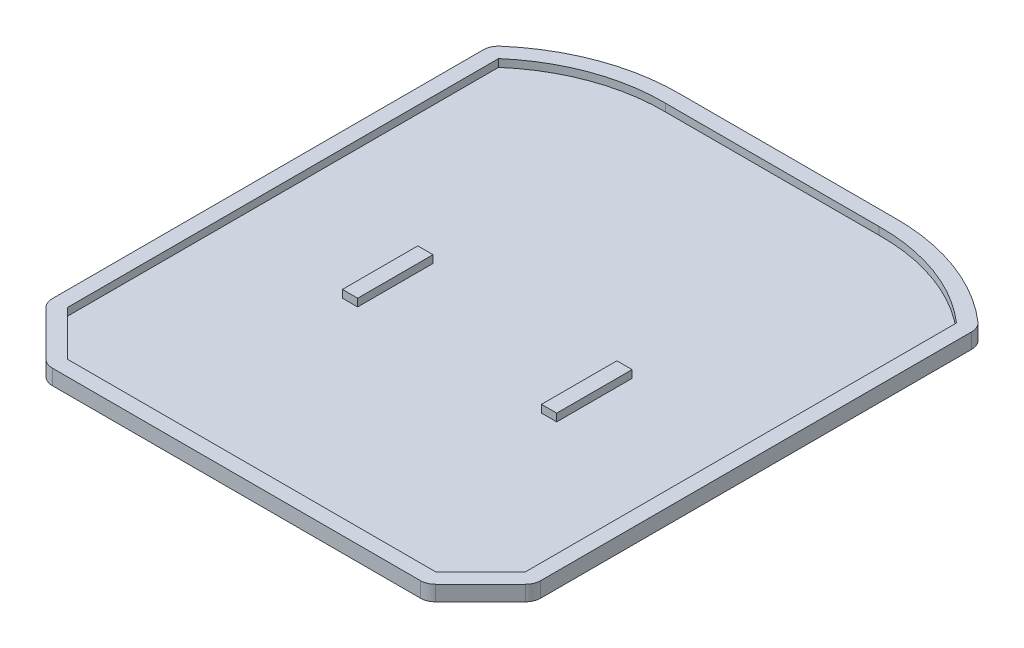
ISO-10303-21;
HEADER;
FILE_DESCRIPTION(('STEP AP214'),'2;1');
FILE_NAME('part.step','',(''),(''),'','','');
FILE_SCHEMA(('AUTOMOTIVE_DESIGN { 1 0 10303 214 1 1 1 1 }'));
ENDSEC;
DATA;
#1=APPLICATION_CONTEXT('core data for automotive mechanical design processes');
#2=APPLICATION_PROTOCOL_DEFINITION('international standard','automotive_design',2000,#1);
#3=PRODUCT_CONTEXT('',#1,'mechanical');
#4=PRODUCT('Part','Part','',(#3));
#5=PRODUCT_RELATED_PRODUCT_CATEGORY('part','',(#4));
#6=PRODUCT_DEFINITION_FORMATION('','',#4);
#7=PRODUCT_DEFINITION_CONTEXT('part definition',#1,'design');
#8=PRODUCT_DEFINITION('design','',#6,#7);
#9=PRODUCT_DEFINITION_SHAPE('','',#8);
#10=(LENGTH_UNIT() NAMED_UNIT(*) SI_UNIT(.MILLI.,.METRE.));
#11=(NAMED_UNIT(*) PLANE_ANGLE_UNIT() SI_UNIT($,.RADIAN.));
#12=(NAMED_UNIT(*) SI_UNIT($,.STERADIAN.) SOLID_ANGLE_UNIT());
#13=UNCERTAINTY_MEASURE_WITH_UNIT(LENGTH_MEASURE(1.E-05),#10,'distance_accuracy_value','');
#14=(GEOMETRIC_REPRESENTATION_CONTEXT(3) GLOBAL_UNCERTAINTY_ASSIGNED_CONTEXT((#13)) GLOBAL_UNIT_ASSIGNED_CONTEXT((#10,
#11,#12)) REPRESENTATION_CONTEXT('',''));
#15=CARTESIAN_POINT('',(0.,0.,0.));
#16=DIRECTION('',(0.,0.,1.));
#17=DIRECTION('',(1.,0.,0.));
#18=AXIS2_PLACEMENT_3D('',#15,#16,#17);
#19=CARTESIAN_POINT('',(53.3964443975312,5.,-231.965229399285));
#20=DIRECTION('',(0.,1.,0.));
#21=DIRECTION('',(0.,0.,1.));
#22=AXIS2_PLACEMENT_3D('',#19,#20,#21);
#23=PLANE('',#22);
#24=DIRECTION('',(1.,0.,0.));
#25=VECTOR('',#24,1.);
#26=CARTESIAN_POINT('',(54.6446609406724,5.,-189.5));
#27=LINE('',#26,#25);
#28=CARTESIAN_POINT('',(54.6446609406724,5.,-189.5));
#29=VERTEX_POINT('',#28);
#30=CARTESIAN_POINT('',(64.6446609406723,5.,-189.5));
#31=VERTEX_POINT('',#30);
#32=EDGE_CURVE('E233',#29,#31,#27,.T.);
#33=ORIENTED_EDGE('',*,*,#32,.T.);
#34=DIRECTION('',(0.,0.,1.));
#35=VECTOR('',#34,1.);
#36=CARTESIAN_POINT('',(64.6446609406723,5.,-189.5));
#37=LINE('',#36,#35);
#38=CARTESIAN_POINT('',(64.6446609406723,5.,-140.));
#39=VERTEX_POINT('',#38);
#40=EDGE_CURVE('E237',#31,#39,#37,.T.);
#41=ORIENTED_EDGE('',*,*,#40,.T.);
#42=DIRECTION('',(1.,0.,0.));
#43=VECTOR('',#42,1.);
#44=CARTESIAN_POINT('',(54.6446609406724,5.,-140.));
#45=LINE('',#44,#43);
#46=CARTESIAN_POINT('',(54.6446609406724,5.,-140.));
#47=VERTEX_POINT('',#46);
#48=EDGE_CURVE('E259',#47,#39,#45,.T.);
#49=ORIENTED_EDGE('',*,*,#48,.F.);
#50=DIRECTION('',(0.,0.,1.));
#51=VECTOR('',#50,1.);
#52=CARTESIAN_POINT('',(54.6446609406724,5.,-189.5));
#53=LINE('',#52,#51);
#54=EDGE_CURVE('E240',#29,#47,#53,.T.);
#55=ORIENTED_EDGE('',*,*,#54,.F.);
#56=EDGE_LOOP('',(#33,#41,#49,#55));
#57=FACE_BOUND('',#56,.T.);
#58=CARTESIAN_POINT('',(53.3964443975312,5.,-231.965229399285));
#59=DIRECTION('',(0.,1.,0.));
#60=DIRECTION('',(0.,0.,1.));
#61=AXIS2_PLACEMENT_3D('',#58,#59,#60);
#62=CIRCLE('',#61,120.);
#63=CARTESIAN_POINT('',(54.9370883444129,5.,-351.955339059327));
#64=VERTEX_POINT('',#63);
#65=CARTESIAN_POINT('',(-25.3553390593276,5.,-322.508901747849));
#66=VERTEX_POINT('',#65);
#67=EDGE_CURVE('E303',#64,#66,#62,.T.);
#68=ORIENTED_EDGE('',*,*,#67,.T.);
#69=DIRECTION('',(0.,0.,1.));
#70=VECTOR('',#69,1.);
#71=CARTESIAN_POINT('',(-25.3553390593276,5.,-322.508901747849));
#72=LINE('',#71,#70);
#73=CARTESIAN_POINT('',(-25.3553390593277,5.,-39.4974746830582));
#74=VERTEX_POINT('',#73);
#75=EDGE_CURVE('E306',#66,#74,#72,.T.);
#76=ORIENTED_EDGE('',*,*,#75,.T.);
#77=DIRECTION('',(0.707106781186548,0.,0.707106781186547));
#78=VECTOR('',#77,1.);
#79=CARTESIAN_POINT('',(-25.3553390593277,5.,-39.4974746830582));
#80=LINE('',#79,#78);
#81=CARTESIAN_POINT('',(4.14213562373051,5.,-10.));
#82=VERTEX_POINT('',#81);
#83=EDGE_CURVE('E310',#74,#82,#80,.T.);
#84=ORIENTED_EDGE('',*,*,#83,.T.);
#85=DIRECTION('',(1.,0.,0.));
#86=VECTOR('',#85,1.);
#87=CARTESIAN_POINT('',(4.14213562373051,5.,-10.));
#88=LINE('',#87,#86);
#89=CARTESIAN_POINT('',(245.857864376269,5.,-10.));
#90=VERTEX_POINT('',#89);
#91=EDGE_CURVE('E313',#82,#90,#88,.T.);
#92=ORIENTED_EDGE('',*,*,#91,.T.);
#93=DIRECTION('',(0.707106781186551,0.,-0.707106781186544));
#94=VECTOR('',#93,1.);
#95=CARTESIAN_POINT('',(245.857864376269,5.,-10.));
#96=LINE('',#95,#94);
#97=CARTESIAN_POINT('',(275.355339059331,5.,-39.4974746830613));
#98=VERTEX_POINT('',#97);
#99=EDGE_CURVE('E316',#90,#98,#96,.T.);
#100=ORIENTED_EDGE('',*,*,#99,.T.);
#101=DIRECTION('',(0.,0.,-1.));
#102=VECTOR('',#101,1.);
#103=CARTESIAN_POINT('',(275.355339059331,5.,-39.4974746830613));
#104=LINE('',#103,#102);
#105=CARTESIAN_POINT('',(275.355339059331,5.,-322.508901747849));
#106=VERTEX_POINT('',#105);
#107=EDGE_CURVE('E319',#98,#106,#104,.T.);
#108=ORIENTED_EDGE('',*,*,#107,.T.);
#109=CARTESIAN_POINT('',(196.603555602472,5.,-231.965229399285));
#110=DIRECTION('',(0.,1.,0.));
#111=DIRECTION('',(0.,0.,1.));
#112=AXIS2_PLACEMENT_3D('',#109,#110,#111);
#113=CIRCLE('',#112,120.);
#114=CARTESIAN_POINT('',(195.062911655588,5.,-351.955339059327));
#115=VERTEX_POINT('',#114);
#116=EDGE_CURVE('E322',#106,#115,#113,.T.);
#117=ORIENTED_EDGE('',*,*,#116,.T.);
#118=DIRECTION('',(-1.,0.,0.));
#119=VECTOR('',#118,1.);
#120=CARTESIAN_POINT('',(195.062911655588,5.,-351.955339059327));
#121=LINE('',#120,#119);
#122=EDGE_CURVE('E325',#115,#64,#121,.T.);
#123=ORIENTED_EDGE('',*,*,#122,.T.);
#124=EDGE_LOOP('',(#68,#76,#84,#92,#100,#108,#117,#123));
#125=FACE_BOUND('',#124,.T.);
#126=DIRECTION('',(0.,0.,1.));
#127=VECTOR('',#126,1.);
#128=CARTESIAN_POINT('',(185.355339059328,5.,-189.5));
#129=LINE('',#128,#127);
#130=CARTESIAN_POINT('',(185.355339059328,5.,-189.5));
#131=VERTEX_POINT('',#130);
#132=CARTESIAN_POINT('',(185.355339059328,5.,-140.));
#133=VERTEX_POINT('',#132);
#134=EDGE_CURVE('E285',#131,#133,#129,.T.);
#135=ORIENTED_EDGE('',*,*,#134,.F.);
#136=DIRECTION('',(-1.,0.,0.));
#137=VECTOR('',#136,1.);
#138=CARTESIAN_POINT('',(195.355339059328,5.,-189.5));
#139=LINE('',#138,#137);
#140=CARTESIAN_POINT('',(195.355339059328,5.,-189.5));
#141=VERTEX_POINT('',#140);
#142=EDGE_CURVE('E243',#141,#131,#139,.T.);
#143=ORIENTED_EDGE('',*,*,#142,.F.);
#144=DIRECTION('',(0.,0.,1.));
#145=VECTOR('',#144,1.);
#146=CARTESIAN_POINT('',(195.355339059328,5.,-189.5));
#147=LINE('',#146,#145);
#148=CARTESIAN_POINT('',(195.355339059329,5.,-140.));
#149=VERTEX_POINT('',#148);
#150=EDGE_CURVE('E274',#141,#149,#147,.T.);
#151=ORIENTED_EDGE('',*,*,#150,.T.);
#152=DIRECTION('',(-1.,0.,0.));
#153=VECTOR('',#152,1.);
#154=CARTESIAN_POINT('',(195.355339059328,5.,-140.));
#155=LINE('',#154,#153);
#156=EDGE_CURVE('E288',#149,#133,#155,.T.);
#157=ORIENTED_EDGE('',*,*,#156,.T.);
#158=EDGE_LOOP('',(#135,#143,#151,#157));
#159=FACE_BOUND('',#158,.T.);
#160=ADVANCED_FACE('F36',(#57,#125,#159),#23,.T.);
#161=CARTESIAN_POINT('',(-35.3553390593277,10.,-326.955339059327));
#162=DIRECTION('',(1.,0.,0.));
#163=DIRECTION('',(0.,0.,-1.));
#164=AXIS2_PLACEMENT_3D('',#161,#162,#163);
#165=PLANE('',#164);
#166=DIRECTION('',(0.,0.,1.));
#167=VECTOR('',#166,1.);
#168=CARTESIAN_POINT('',(-35.3553390593277,10.,-326.955339059327));
#169=LINE('',#168,#167);
#170=CARTESIAN_POINT('',(-35.3553390593277,10.,-322.508901747848));
#171=VERTEX_POINT('',#170);
#172=CARTESIAN_POINT('',(-35.3553390593276,10.,-39.4974746830581));
#173=VERTEX_POINT('',#172);
#174=EDGE_CURVE('E367',#171,#173,#169,.T.);
#175=ORIENTED_EDGE('',*,*,#174,.F.);
#176=DIRECTION('',(0.,1.,0.));
#177=VECTOR('',#176,1.);
#178=CARTESIAN_POINT('',(-35.3553390593277,0.,-322.508901747848));
#179=LINE('',#178,#177);
#180=CARTESIAN_POINT('',(-35.3553390593277,0.,-322.508901747848));
#181=VERTEX_POINT('',#180);
#182=EDGE_CURVE('E416',#171,#181,#179,.F.);
#183=ORIENTED_EDGE('',*,*,#182,.T.);
#184=DIRECTION('',(0.,0.,1.));
#185=VECTOR('',#184,1.);
#186=CARTESIAN_POINT('',(-35.3553390593277,0.,-326.955339059327));
#187=LINE('',#186,#185);
#188=CARTESIAN_POINT('',(-35.3553390593276,0.,-39.4974746830581));
#189=VERTEX_POINT('',#188);
#190=EDGE_CURVE('E352',#181,#189,#187,.T.);
#191=ORIENTED_EDGE('',*,*,#190,.T.);
#192=DIRECTION('',(0.,-1.,0.));
#193=VECTOR('',#192,1.);
#194=CARTESIAN_POINT('',(-35.3553390593276,10.,-39.4974746830582));
#195=LINE('',#194,#193);
#196=EDGE_CURVE('E414',#189,#173,#195,.F.);
#197=ORIENTED_EDGE('',*,*,#196,.T.);
#198=EDGE_LOOP('',(#175,#183,#191,#197));
#199=FACE_BOUND('',#198,.T.);
#200=ADVANCED_FACE('F519',(#199),#165,.F.);
#201=CARTESIAN_POINT('',(0.,10.,0.));
#202=DIRECTION('',(-0.707106781186543,0.,0.707106781186552));
#203=DIRECTION('',(0.707106781186552,0.,0.707106781186543));
#204=AXIS2_PLACEMENT_3D('',#201,#202,#203);
#205=PLANE('',#204);
#206=DIRECTION('',(-0.707106781186552,0.,-0.707106781186543));
#207=VECTOR('',#206,1.);
#208=CARTESIAN_POINT('',(0.,0.,0.));
#209=LINE('',#208,#207);
#210=CARTESIAN_POINT('',(-2.92893218813452,0.,-2.92893218813448));
#211=VERTEX_POINT('',#210);
#212=CARTESIAN_POINT('',(-32.426406871193,0.,-32.4264068711926));
#213=VERTEX_POINT('',#212);
#214=EDGE_CURVE('E392',#211,#213,#209,.T.);
#215=ORIENTED_EDGE('',*,*,#214,.F.);
#216=DIRECTION('',(0.,-1.,0.));
#217=VECTOR('',#216,1.);
#218=CARTESIAN_POINT('',(-2.92893218813452,10.,-2.92893218813448));
#219=LINE('',#218,#217);
#220=CARTESIAN_POINT('',(-2.92893218813452,10.,-2.92893218813448));
#221=VERTEX_POINT('',#220);
#222=EDGE_CURVE('E11',#211,#221,#219,.F.);
#223=ORIENTED_EDGE('',*,*,#222,.T.);
#224=DIRECTION('',(-0.707106781186552,0.,-0.707106781186543));
#225=VECTOR('',#224,1.);
#226=CARTESIAN_POINT('',(0.,10.,0.));
#227=LINE('',#226,#225);
#228=CARTESIAN_POINT('',(-32.426406871193,10.,-32.4264068711926));
#229=VERTEX_POINT('',#228);
#230=EDGE_CURVE('E370',#221,#229,#227,.T.);
#231=ORIENTED_EDGE('',*,*,#230,.T.);
#232=DIRECTION('',(0.,-1.,0.));
#233=VECTOR('',#232,1.);
#234=CARTESIAN_POINT('',(-32.426406871193,0.,-32.4264068711926));
#235=LINE('',#234,#233);
#236=EDGE_CURVE('E44',#229,#213,#235,.T.);
#237=ORIENTED_EDGE('',*,*,#236,.T.);
#238=EDGE_LOOP('',(#215,#223,#231,#237));
#239=FACE_BOUND('',#238,.T.);
#240=ADVANCED_FACE('F464',(#239),#205,.T.);
#241=CARTESIAN_POINT('',(0.,10.,0.));
#242=DIRECTION('',(0.,0.,-1.));
#243=DIRECTION('',(-1.,0.,0.));
#244=AXIS2_PLACEMENT_3D('',#241,#242,#243);
#245=PLANE('',#244);
#246=DIRECTION('',(1.,0.,0.));
#247=VECTOR('',#246,1.);
#248=CARTESIAN_POINT('',(0.,0.,0.));
#249=LINE('',#248,#247);
#250=CARTESIAN_POINT('',(4.14213562373091,0.,0.));
#251=VERTEX_POINT('',#250);
#252=CARTESIAN_POINT('',(245.857864376269,0.,0.));
#253=VERTEX_POINT('',#252);
#254=EDGE_CURVE('E395',#251,#253,#249,.T.);
#255=ORIENTED_EDGE('',*,*,#254,.T.);
#256=DIRECTION('',(0.,-1.,0.));
#257=VECTOR('',#256,1.);
#258=CARTESIAN_POINT('',(245.857864376269,10.,0.));
#259=LINE('',#258,#257);
#260=CARTESIAN_POINT('',(245.857864376269,10.,0.));
#261=VERTEX_POINT('',#260);
#262=EDGE_CURVE('E459',#253,#261,#259,.F.);
#263=ORIENTED_EDGE('',*,*,#262,.T.);
#264=DIRECTION('',(1.,0.,0.));
#265=VECTOR('',#264,1.);
#266=CARTESIAN_POINT('',(0.,10.,0.));
#267=LINE('',#266,#265);
#268=CARTESIAN_POINT('',(4.14213562373091,10.,0.));
#269=VERTEX_POINT('',#268);
#270=EDGE_CURVE('E374',#269,#261,#267,.T.);
#271=ORIENTED_EDGE('',*,*,#270,.F.);
#272=DIRECTION('',(0.,-1.,0.));
#273=VECTOR('',#272,1.);
#274=CARTESIAN_POINT('',(4.14213562373091,0.,0.));
#275=LINE('',#274,#273);
#276=EDGE_CURVE('E456',#269,#251,#275,.T.);
#277=ORIENTED_EDGE('',*,*,#276,.T.);
#278=EDGE_LOOP('',(#255,#263,#271,#277));
#279=FACE_BOUND('',#278,.T.);
#280=ADVANCED_FACE('F479',(#279),#245,.F.);
#281=CARTESIAN_POINT('',(285.355339059328,10.,-35.3553390593272));
#282=DIRECTION('',(0.707106781186544,0.,0.707106781186551));
#283=DIRECTION('',(0.707106781186551,0.,-0.707106781186544));
#284=AXIS2_PLACEMENT_3D('',#281,#282,#283);
#285=PLANE('',#284);
#286=DIRECTION('',(-0.707106781186551,0.,0.707106781186544));
#287=VECTOR('',#286,1.);
#288=CARTESIAN_POINT('',(285.355339059328,0.,-35.3553390593272));
#289=LINE('',#288,#287);
#290=CARTESIAN_POINT('',(282.426406871193,0.,-32.4264068711927));
#291=VERTEX_POINT('',#290);
#292=CARTESIAN_POINT('',(252.928932188134,0.,-2.92893218813448));
#293=VERTEX_POINT('',#292);
#294=EDGE_CURVE('E398',#291,#293,#289,.T.);
#295=ORIENTED_EDGE('',*,*,#294,.F.);
#296=DIRECTION('',(0.,-1.,0.));
#297=VECTOR('',#296,1.);
#298=CARTESIAN_POINT('',(282.426406871193,10.,-32.4264068711927));
#299=LINE('',#298,#297);
#300=CARTESIAN_POINT('',(282.426406871193,10.,-32.4264068711927));
#301=VERTEX_POINT('',#300);
#302=EDGE_CURVE('E454',#291,#301,#299,.F.);
#303=ORIENTED_EDGE('',*,*,#302,.T.);
#304=DIRECTION('',(-0.707106781186551,0.,0.707106781186544));
#305=VECTOR('',#304,1.);
#306=CARTESIAN_POINT('',(285.355339059328,10.,-35.3553390593272));
#307=LINE('',#306,#305);
#308=CARTESIAN_POINT('',(252.928932188134,10.,-2.92893218813448));
#309=VERTEX_POINT('',#308);
#310=EDGE_CURVE('E377',#301,#309,#307,.T.);
#311=ORIENTED_EDGE('',*,*,#310,.T.);
#312=DIRECTION('',(0.,-1.,0.));
#313=VECTOR('',#312,1.);
#314=CARTESIAN_POINT('',(252.928932188134,0.,-2.92893218813448));
#315=LINE('',#314,#313);
#316=EDGE_CURVE('E451',#309,#293,#315,.T.);
#317=ORIENTED_EDGE('',*,*,#316,.T.);
#318=EDGE_LOOP('',(#295,#303,#311,#317));
#319=FACE_BOUND('',#318,.T.);
#320=ADVANCED_FACE('F490',(#319),#285,.T.);
#321=CARTESIAN_POINT('',(285.355339059328,10.,-35.3553390593272));
#322=DIRECTION('',(-1.,0.,0.));
#323=DIRECTION('',(0.,0.,1.));
#324=AXIS2_PLACEMENT_3D('',#321,#322,#323);
#325=PLANE('',#324);
#326=DIRECTION('',(0.,0.,-1.));
#327=VECTOR('',#326,1.);
#328=CARTESIAN_POINT('',(285.355339059328,0.,-35.3553390593272));
#329=LINE('',#328,#327);
#330=CARTESIAN_POINT('',(285.355339059328,0.,-39.4974746830581));
#331=VERTEX_POINT('',#330);
#332=CARTESIAN_POINT('',(285.355339059331,0.,-322.508901747848));
#333=VERTEX_POINT('',#332);
#334=EDGE_CURVE('E401',#331,#333,#329,.T.);
#335=ORIENTED_EDGE('',*,*,#334,.T.);
#336=DIRECTION('',(0.,-1.,0.));
#337=VECTOR('',#336,1.);
#338=CARTESIAN_POINT('',(285.355339059331,10.,-322.508901747848));
#339=LINE('',#338,#337);
#340=CARTESIAN_POINT('',(285.355339059331,10.,-322.508901747848));
#341=VERTEX_POINT('',#340);
#342=EDGE_CURVE('E59',#333,#341,#339,.F.);
#343=ORIENTED_EDGE('',*,*,#342,.T.);
#344=DIRECTION('',(0.,0.,-1.));
#345=VECTOR('',#344,1.);
#346=CARTESIAN_POINT('',(285.355339059328,10.,-35.3553390593272));
#347=LINE('',#346,#345);
#348=CARTESIAN_POINT('',(285.355339059328,10.,-39.4974746830581));
#349=VERTEX_POINT('',#348);
#350=EDGE_CURVE('E380',#349,#341,#347,.T.);
#351=ORIENTED_EDGE('',*,*,#350,.F.);
#352=DIRECTION('',(0.,-1.,0.));
#353=VECTOR('',#352,1.);
#354=CARTESIAN_POINT('',(285.355339059328,0.,-39.4974746830581));
#355=LINE('',#354,#353);
#356=EDGE_CURVE('E447',#349,#331,#355,.T.);
#357=ORIENTED_EDGE('',*,*,#356,.T.);
#358=EDGE_LOOP('',(#335,#343,#351,#357));
#359=FACE_BOUND('',#358,.T.);
#360=ADVANCED_FACE('F497',(#359),#325,.F.);
#361=CARTESIAN_POINT('',(196.603555602472,10.,-231.965229399285));
#362=DIRECTION('',(0.,-1.,0.));
#363=DIRECTION('',(0.,0.,-1.));
#364=AXIS2_PLACEMENT_3D('',#361,#362,#363);
#365=CYLINDRICAL_SURFACE('',#364,130.);
#366=CARTESIAN_POINT('',(196.603555602472,10.,-231.965229399285));
#367=DIRECTION('',(0.,1.,0.));
#368=DIRECTION('',(0.,0.,1.));
#369=AXIS2_PLACEMENT_3D('',#366,#367,#368);
#370=CIRCLE('',#369,130.);
#371=CARTESIAN_POINT('',(281.917987680735,10.,-330.054207776895));
#372=VERTEX_POINT('',#371);
#373=CARTESIAN_POINT('',(195.,10.,-361.955339059327));
#374=VERTEX_POINT('',#373);
#375=EDGE_CURVE('E382',#372,#374,#370,.T.);
#376=ORIENTED_EDGE('',*,*,#375,.F.);
#377=DIRECTION('',(0.,-1.,0.));
#378=VECTOR('',#377,1.);
#379=CARTESIAN_POINT('',(281.917987680736,10.,-330.054207776895));
#380=LINE('',#379,#378);
#381=CARTESIAN_POINT('',(281.917987680735,0.,-330.054207776895));
#382=VERTEX_POINT('',#381);
#383=EDGE_CURVE('E444',#372,#382,#380,.T.);
#384=ORIENTED_EDGE('',*,*,#383,.T.);
#385=CARTESIAN_POINT('',(196.603555602472,0.,-231.965229399285));
#386=DIRECTION('',(0.,1.,0.));
#387=DIRECTION('',(0.,0.,1.));
#388=AXIS2_PLACEMENT_3D('',#385,#386,#387);
#389=CIRCLE('',#388,130.);
#390=CARTESIAN_POINT('',(195.,0.,-361.955339059327));
#391=VERTEX_POINT('',#390);
#392=EDGE_CURVE('E403',#382,#391,#389,.T.);
#393=ORIENTED_EDGE('',*,*,#392,.T.);
#394=DIRECTION('',(0.,-1.,0.));
#395=VECTOR('',#394,1.);
#396=CARTESIAN_POINT('',(195.,10.,-361.955339059327));
#397=LINE('',#396,#395);
#398=EDGE_CURVE('E411',#374,#391,#397,.T.);
#399=ORIENTED_EDGE('',*,*,#398,.F.);
#400=EDGE_LOOP('',(#376,#384,#393,#399));
#401=FACE_BOUND('',#400,.T.);
#402=ADVANCED_FACE('F503',(#401),#365,.T.);
#403=CARTESIAN_POINT('',(55.,10.,-361.955339059327));
#404=DIRECTION('',(0.,0.,-1.));
#405=DIRECTION('',(-1.,0.,0.));
#406=AXIS2_PLACEMENT_3D('',#403,#404,#405);
#407=PLANE('',#406);
#408=DIRECTION('',(1.,0.,0.));
#409=VECTOR('',#408,1.);
#410=CARTESIAN_POINT('',(55.,0.,-361.955339059327));
#411=LINE('',#410,#409);
#412=CARTESIAN_POINT('',(55.,0.,-361.955339059327));
#413=VERTEX_POINT('',#412);
#414=EDGE_CURVE('E405',#413,#391,#411,.T.);
#415=ORIENTED_EDGE('',*,*,#414,.F.);
#416=DIRECTION('',(0.,-1.,0.));
#417=VECTOR('',#416,1.);
#418=CARTESIAN_POINT('',(55.,10.,-361.955339059327));
#419=LINE('',#418,#417);
#420=CARTESIAN_POINT('',(55.,10.,-361.955339059327));
#421=VERTEX_POINT('',#420);
#422=EDGE_CURVE('E389',#421,#413,#419,.T.);
#423=ORIENTED_EDGE('',*,*,#422,.F.);
#424=DIRECTION('',(1.,0.,0.));
#425=VECTOR('',#424,1.);
#426=CARTESIAN_POINT('',(55.,10.,-361.955339059327));
#427=LINE('',#426,#425);
#428=EDGE_CURVE('E384',#421,#374,#427,.T.);
#429=ORIENTED_EDGE('',*,*,#428,.T.);
#430=ORIENTED_EDGE('',*,*,#398,.T.);
#431=EDGE_LOOP('',(#415,#423,#429,#430));
#432=FACE_BOUND('',#431,.T.);
#433=ADVANCED_FACE('F509',(#432),#407,.T.);
#434=CARTESIAN_POINT('',(53.3964443975312,10.,-231.965229399285));
#435=DIRECTION('',(0.,-1.,0.));
#436=DIRECTION('',(0.,0.,-1.));
#437=AXIS2_PLACEMENT_3D('',#434,#435,#436);
#438=CYLINDRICAL_SURFACE('',#437,130.);
#439=CARTESIAN_POINT('',(53.3964443975312,0.,-231.965229399285));
#440=DIRECTION('',(0.,-1.,0.));
#441=DIRECTION('',(0.,0.,-1.));
#442=AXIS2_PLACEMENT_3D('',#439,#440,#441);
#443=CIRCLE('',#442,130.);
#444=CARTESIAN_POINT('',(-31.9179876807326,0.,-330.054207776895));
#445=VERTEX_POINT('',#444);
#446=EDGE_CURVE('E371',#445,#413,#443,.T.);
#447=ORIENTED_EDGE('',*,*,#446,.F.);
#448=DIRECTION('',(0.,-1.,0.));
#449=VECTOR('',#448,1.);
#450=CARTESIAN_POINT('',(-31.9179876807326,10.,-330.054207776895));
#451=LINE('',#450,#449);
#452=CARTESIAN_POINT('',(-31.9179876807326,10.,-330.054207776895));
#453=VERTEX_POINT('',#452);
#454=EDGE_CURVE('E431',#445,#453,#451,.F.);
#455=ORIENTED_EDGE('',*,*,#454,.T.);
#456=CARTESIAN_POINT('',(53.3964443975312,10.,-231.965229399285));
#457=DIRECTION('',(0.,-1.,0.));
#458=DIRECTION('',(0.,0.,-1.));
#459=AXIS2_PLACEMENT_3D('',#456,#457,#458);
#460=CIRCLE('',#459,130.);
#461=EDGE_CURVE('E387',#453,#421,#460,.T.);
#462=ORIENTED_EDGE('',*,*,#461,.T.);
#463=ORIENTED_EDGE('',*,*,#422,.T.);
#464=EDGE_LOOP('',(#447,#455,#462,#463));
#465=FACE_BOUND('',#464,.T.);
#466=ADVANCED_FACE('F521',(#465),#438,.T.);
#467=CARTESIAN_POINT('',(196.603555602472,10.,-231.965229399285));
#468=DIRECTION('',(0.,1.,0.));
#469=DIRECTION('',(0.,0.,1.));
#470=AXIS2_PLACEMENT_3D('',#467,#468,#469);
#471=PLANE('',#470);
#472=CARTESIAN_POINT('',(53.3964443975312,10.,-231.965229399285));
#473=DIRECTION('',(0.,1.,0.));
#474=DIRECTION('',(0.,0.,1.));
#475=AXIS2_PLACEMENT_3D('',#472,#473,#474);
#476=CIRCLE('',#475,120.);
#477=CARTESIAN_POINT('',(54.9370883444129,10.,-351.955339059327));
#478=VERTEX_POINT('',#477);
#479=CARTESIAN_POINT('',(-25.3553390593276,10.,-322.508901747849));
#480=VERTEX_POINT('',#479);
#481=EDGE_CURVE('E302',#478,#480,#476,.T.);
#482=ORIENTED_EDGE('',*,*,#481,.F.);
#483=DIRECTION('',(-1.,0.,0.));
#484=VECTOR('',#483,1.);
#485=CARTESIAN_POINT('',(195.062911655588,10.,-351.955339059327));
#486=LINE('',#485,#484);
#487=CARTESIAN_POINT('',(195.062911655588,10.,-351.955339059327));
#488=VERTEX_POINT('',#487);
#489=EDGE_CURVE('E307',#488,#478,#486,.T.);
#490=ORIENTED_EDGE('',*,*,#489,.F.);
#491=CARTESIAN_POINT('',(196.603555602472,10.,-231.965229399285));
#492=DIRECTION('',(0.,1.,0.));
#493=DIRECTION('',(0.,0.,1.));
#494=AXIS2_PLACEMENT_3D('',#491,#492,#493);
#495=CIRCLE('',#494,120.);
#496=CARTESIAN_POINT('',(275.355339059331,10.,-322.508901747849));
#497=VERTEX_POINT('',#496);
#498=EDGE_CURVE('E345',#497,#488,#495,.T.);
#499=ORIENTED_EDGE('',*,*,#498,.F.);
#500=DIRECTION('',(0.,0.,-1.));
#501=VECTOR('',#500,1.);
#502=CARTESIAN_POINT('',(275.355339059331,10.,-39.4974746830613));
#503=LINE('',#502,#501);
#504=CARTESIAN_POINT('',(275.355339059331,10.,-39.4974746830613));
#505=VERTEX_POINT('',#504);
#506=EDGE_CURVE('E342',#505,#497,#503,.T.);
#507=ORIENTED_EDGE('',*,*,#506,.F.);
#508=DIRECTION('',(0.707106781186551,0.,-0.707106781186544));
#509=VECTOR('',#508,1.);
#510=CARTESIAN_POINT('',(245.857864376269,10.,-10.));
#511=LINE('',#510,#509);
#512=CARTESIAN_POINT('',(245.857864376269,10.,-10.));
#513=VERTEX_POINT('',#512);
#514=EDGE_CURVE('E339',#513,#505,#511,.T.);
#515=ORIENTED_EDGE('',*,*,#514,.F.);
#516=DIRECTION('',(1.,0.,0.));
#517=VECTOR('',#516,1.);
#518=CARTESIAN_POINT('',(4.14213562373051,10.,-10.));
#519=LINE('',#518,#517);
#520=CARTESIAN_POINT('',(4.14213562373051,10.,-10.));
#521=VERTEX_POINT('',#520);
#522=EDGE_CURVE('E336',#521,#513,#519,.T.);
#523=ORIENTED_EDGE('',*,*,#522,.F.);
#524=DIRECTION('',(0.707106781186548,0.,0.707106781186547));
#525=VECTOR('',#524,1.);
#526=CARTESIAN_POINT('',(-25.3553390593277,10.,-39.4974746830582));
#527=LINE('',#526,#525);
#528=CARTESIAN_POINT('',(-25.3553390593277,10.,-39.4974746830582));
#529=VERTEX_POINT('',#528);
#530=EDGE_CURVE('E333',#529,#521,#527,.T.);
#531=ORIENTED_EDGE('',*,*,#530,.F.);
#532=DIRECTION('',(0.,0.,1.));
#533=VECTOR('',#532,1.);
#534=CARTESIAN_POINT('',(-25.3553390593276,10.,-322.508901747849));
#535=LINE('',#534,#533);
#536=EDGE_CURVE('E330',#480,#529,#535,.T.);
#537=ORIENTED_EDGE('',*,*,#536,.F.);
#538=EDGE_LOOP('',(#482,#490,#499,#507,#515,#523,#531,#537));
#539=FACE_BOUND('',#538,.T.);
#540=ORIENTED_EDGE('',*,*,#461,.F.);
#541=CARTESIAN_POINT('',(-25.3553390593277,10.,-322.508901747848));
#542=DIRECTION('',(0.,1.,0.));
#543=DIRECTION('',(0.,0.,1.));
#544=AXIS2_PLACEMENT_3D('',#541,#542,#543);
#545=CIRCLE('',#544,10.);
#546=EDGE_CURVE('E442',#453,#171,#545,.T.);
#547=ORIENTED_EDGE('',*,*,#546,.T.);
#548=ORIENTED_EDGE('',*,*,#174,.T.);
#549=CARTESIAN_POINT('',(-25.3553390593276,10.,-39.4974746830582));
#550=DIRECTION('',(0.,1.,0.));
#551=DIRECTION('',(0.,0.,1.));
#552=AXIS2_PLACEMENT_3D('',#549,#550,#551);
#553=CIRCLE('',#552,10.);
#554=EDGE_CURVE('E433',#173,#229,#553,.T.);
#555=ORIENTED_EDGE('',*,*,#554,.T.);
#556=ORIENTED_EDGE('',*,*,#230,.F.);
#557=CARTESIAN_POINT('',(4.14213562373091,10.,-10.));
#558=DIRECTION('',(0.,1.,0.));
#559=DIRECTION('',(0.,0.,1.));
#560=AXIS2_PLACEMENT_3D('',#557,#558,#559);
#561=CIRCLE('',#560,10.);
#562=EDGE_CURVE('E435',#221,#269,#561,.T.);
#563=ORIENTED_EDGE('',*,*,#562,.T.);
#564=ORIENTED_EDGE('',*,*,#270,.T.);
#565=CARTESIAN_POINT('',(245.857864376269,10.,-10.));
#566=DIRECTION('',(0.,1.,0.));
#567=DIRECTION('',(0.,0.,1.));
#568=AXIS2_PLACEMENT_3D('',#565,#566,#567);
#569=CIRCLE('',#568,10.);
#570=EDGE_CURVE('E437',#261,#309,#569,.T.);
#571=ORIENTED_EDGE('',*,*,#570,.T.);
#572=ORIENTED_EDGE('',*,*,#310,.F.);
#573=CARTESIAN_POINT('',(275.355339059328,10.,-39.4974746830582));
#574=DIRECTION('',(0.,1.,0.));
#575=DIRECTION('',(0.,0.,1.));
#576=AXIS2_PLACEMENT_3D('',#573,#574,#575);
#577=CIRCLE('',#576,10.);
#578=EDGE_CURVE('E439',#301,#349,#577,.T.);
#579=ORIENTED_EDGE('',*,*,#578,.T.);
#580=ORIENTED_EDGE('',*,*,#350,.T.);
#581=CARTESIAN_POINT('',(275.355339059331,10.,-322.508901747849));
#582=DIRECTION('',(0.,1.,0.));
#583=DIRECTION('',(0.,0.,1.));
#584=AXIS2_PLACEMENT_3D('',#581,#582,#583);
#585=CIRCLE('',#584,10.);
#586=EDGE_CURVE('E51',#341,#372,#585,.T.);
#587=ORIENTED_EDGE('',*,*,#586,.T.);
#588=ORIENTED_EDGE('',*,*,#375,.T.);
#589=ORIENTED_EDGE('',*,*,#428,.F.);
#590=EDGE_LOOP('',(#540,#547,#548,#555,#556,#563,#564,#571,#572,#579,#580,#587,#588,#589));
#591=FACE_BOUND('',#590,.T.);
#592=ADVANCED_FACE('F483',(#539,#591),#471,.T.);
#593=CARTESIAN_POINT('',(196.603555602472,0.,-231.965229399285));
#594=DIRECTION('',(0.,1.,0.));
#595=DIRECTION('',(0.,0.,1.));
#596=AXIS2_PLACEMENT_3D('',#593,#594,#595);
#597=PLANE('',#596);
#598=ORIENTED_EDGE('',*,*,#190,.F.);
#599=CARTESIAN_POINT('',(-25.3553390593277,0.,-322.508901747848));
#600=DIRECTION('',(0.,1.,0.));
#601=DIRECTION('',(0.,0.,1.));
#602=AXIS2_PLACEMENT_3D('',#599,#600,#601);
#603=CIRCLE('',#602,10.);
#604=EDGE_CURVE('E429',#181,#445,#603,.F.);
#605=ORIENTED_EDGE('',*,*,#604,.T.);
#606=ORIENTED_EDGE('',*,*,#446,.T.);
#607=ORIENTED_EDGE('',*,*,#414,.T.);
#608=ORIENTED_EDGE('',*,*,#392,.F.);
#609=CARTESIAN_POINT('',(275.355339059331,0.,-322.508901747849));
#610=DIRECTION('',(0.,1.,0.));
#611=DIRECTION('',(0.,0.,1.));
#612=AXIS2_PLACEMENT_3D('',#609,#610,#611);
#613=CIRCLE('',#612,10.);
#614=EDGE_CURVE('E427',#382,#333,#613,.F.);
#615=ORIENTED_EDGE('',*,*,#614,.T.);
#616=ORIENTED_EDGE('',*,*,#334,.F.);
#617=CARTESIAN_POINT('',(275.355339059328,0.,-39.4974746830582));
#618=DIRECTION('',(0.,1.,0.));
#619=DIRECTION('',(0.,0.,1.));
#620=AXIS2_PLACEMENT_3D('',#617,#618,#619);
#621=CIRCLE('',#620,10.);
#622=EDGE_CURVE('E425',#331,#291,#621,.F.);
#623=ORIENTED_EDGE('',*,*,#622,.T.);
#624=ORIENTED_EDGE('',*,*,#294,.T.);
#625=CARTESIAN_POINT('',(245.857864376269,0.,-10.));
#626=DIRECTION('',(0.,1.,0.));
#627=DIRECTION('',(0.,0.,1.));
#628=AXIS2_PLACEMENT_3D('',#625,#626,#627);
#629=CIRCLE('',#628,10.);
#630=EDGE_CURVE('E423',#293,#253,#629,.F.);
#631=ORIENTED_EDGE('',*,*,#630,.T.);
#632=ORIENTED_EDGE('',*,*,#254,.F.);
#633=CARTESIAN_POINT('',(4.14213562373091,0.,-10.));
#634=DIRECTION('',(0.,1.,0.));
#635=DIRECTION('',(0.,0.,1.));
#636=AXIS2_PLACEMENT_3D('',#633,#634,#635);
#637=CIRCLE('',#636,10.);
#638=EDGE_CURVE('E421',#251,#211,#637,.F.);
#639=ORIENTED_EDGE('',*,*,#638,.T.);
#640=ORIENTED_EDGE('',*,*,#214,.T.);
#641=CARTESIAN_POINT('',(-25.3553390593276,0.,-39.4974746830582));
#642=DIRECTION('',(0.,1.,0.));
#643=DIRECTION('',(0.,0.,1.));
#644=AXIS2_PLACEMENT_3D('',#641,#642,#643);
#645=CIRCLE('',#644,10.);
#646=EDGE_CURVE('E419',#213,#189,#645,.F.);
#647=ORIENTED_EDGE('',*,*,#646,.T.);
#648=EDGE_LOOP('',(#598,#605,#606,#607,#608,#615,#616,#623,#624,#631,#632,#639,#640,#647));
#649=FACE_BOUND('',#648,.T.);
#650=ADVANCED_FACE('F471',(#649),#597,.F.);
#651=CARTESIAN_POINT('',(53.3964443975312,5.,-231.965229399285));
#652=DIRECTION('',(0.,1.,0.));
#653=DIRECTION('',(0.,0.,1.));
#654=AXIS2_PLACEMENT_3D('',#651,#652,#653);
#655=CYLINDRICAL_SURFACE('',#654,120.);
#656=ORIENTED_EDGE('',*,*,#481,.T.);
#657=DIRECTION('',(0.,1.,0.));
#658=VECTOR('',#657,1.);
#659=CARTESIAN_POINT('',(-25.3553390593276,5.,-322.508901747849));
#660=LINE('',#659,#658);
#661=EDGE_CURVE('E328',#66,#480,#660,.T.);
#662=ORIENTED_EDGE('',*,*,#661,.F.);
#663=ORIENTED_EDGE('',*,*,#67,.F.);
#664=DIRECTION('',(0.,1.,0.));
#665=VECTOR('',#664,1.);
#666=CARTESIAN_POINT('',(54.9370883444129,5.,-351.955339059327));
#667=LINE('',#666,#665);
#668=EDGE_CURVE('E350',#64,#478,#667,.T.);
#669=ORIENTED_EDGE('',*,*,#668,.T.);
#670=EDGE_LOOP('',(#656,#662,#663,#669));
#671=FACE_BOUND('',#670,.T.);
#672=ADVANCED_FACE('F547',(#671),#655,.F.);
#673=CARTESIAN_POINT('',(195.062911655588,5.,-351.955339059327));
#674=DIRECTION('',(0.,0.,-1.));
#675=DIRECTION('',(-1.,0.,0.));
#676=AXIS2_PLACEMENT_3D('',#673,#674,#675);
#677=PLANE('',#676);
#678=ORIENTED_EDGE('',*,*,#489,.T.);
#679=ORIENTED_EDGE('',*,*,#668,.F.);
#680=ORIENTED_EDGE('',*,*,#122,.F.);
#681=DIRECTION('',(0.,1.,0.));
#682=VECTOR('',#681,1.);
#683=CARTESIAN_POINT('',(195.062911655588,5.,-351.955339059327));
#684=LINE('',#683,#682);
#685=EDGE_CURVE('E353',#115,#488,#684,.T.);
#686=ORIENTED_EDGE('',*,*,#685,.T.);
#687=EDGE_LOOP('',(#678,#679,#680,#686));
#688=FACE_BOUND('',#687,.T.);
#689=ADVANCED_FACE('F543',(#688),#677,.F.);
#690=CARTESIAN_POINT('',(196.603555602472,5.,-231.965229399285));
#691=DIRECTION('',(0.,1.,0.));
#692=DIRECTION('',(0.,0.,1.));
#693=AXIS2_PLACEMENT_3D('',#690,#691,#692);
#694=CYLINDRICAL_SURFACE('',#693,120.);
#695=ORIENTED_EDGE('',*,*,#498,.T.);
#696=ORIENTED_EDGE('',*,*,#685,.F.);
#697=ORIENTED_EDGE('',*,*,#116,.F.);
#698=DIRECTION('',(0.,1.,0.));
#699=VECTOR('',#698,1.);
#700=CARTESIAN_POINT('',(275.355339059331,5.,-322.508901747849));
#701=LINE('',#700,#699);
#702=EDGE_CURVE('E355',#106,#497,#701,.T.);
#703=ORIENTED_EDGE('',*,*,#702,.T.);
#704=EDGE_LOOP('',(#695,#696,#697,#703));
#705=FACE_BOUND('',#704,.T.);
#706=ADVANCED_FACE('F546',(#705),#694,.F.);
#707=CARTESIAN_POINT('',(275.355339059331,5.,-39.4974746830613));
#708=DIRECTION('',(1.,0.,0.));
#709=DIRECTION('',(0.,0.,-1.));
#710=AXIS2_PLACEMENT_3D('',#707,#708,#709);
#711=PLANE('',#710);
#712=ORIENTED_EDGE('',*,*,#506,.T.);
#713=ORIENTED_EDGE('',*,*,#702,.F.);
#714=ORIENTED_EDGE('',*,*,#107,.F.);
#715=DIRECTION('',(0.,1.,0.));
#716=VECTOR('',#715,1.);
#717=CARTESIAN_POINT('',(275.355339059331,5.,-39.4974746830613));
#718=LINE('',#717,#716);
#719=EDGE_CURVE('E357',#98,#505,#718,.T.);
#720=ORIENTED_EDGE('',*,*,#719,.T.);
#721=EDGE_LOOP('',(#712,#713,#714,#720));
#722=FACE_BOUND('',#721,.T.);
#723=ADVANCED_FACE('F551',(#722),#711,.F.);
#724=CARTESIAN_POINT('',(245.857864376269,5.,-10.));
#725=DIRECTION('',(0.707106781186544,0.,0.707106781186551));
#726=DIRECTION('',(0.707106781186551,0.,-0.707106781186544));
#727=AXIS2_PLACEMENT_3D('',#724,#725,#726);
#728=PLANE('',#727);
#729=ORIENTED_EDGE('',*,*,#514,.T.);
#730=ORIENTED_EDGE('',*,*,#719,.F.);
#731=ORIENTED_EDGE('',*,*,#99,.F.);
#732=DIRECTION('',(0.,1.,0.));
#733=VECTOR('',#732,1.);
#734=CARTESIAN_POINT('',(245.857864376269,5.,-10.));
#735=LINE('',#734,#733);
#736=EDGE_CURVE('E359',#90,#513,#735,.T.);
#737=ORIENTED_EDGE('',*,*,#736,.T.);
#738=EDGE_LOOP('',(#729,#730,#731,#737));
#739=FACE_BOUND('',#738,.T.);
#740=ADVANCED_FACE('F555',(#739),#728,.F.);
#741=CARTESIAN_POINT('',(4.14213562373051,5.,-10.));
#742=DIRECTION('',(0.,0.,1.));
#743=DIRECTION('',(1.,0.,0.));
#744=AXIS2_PLACEMENT_3D('',#741,#742,#743);
#745=PLANE('',#744);
#746=ORIENTED_EDGE('',*,*,#522,.T.);
#747=ORIENTED_EDGE('',*,*,#736,.F.);
#748=ORIENTED_EDGE('',*,*,#91,.F.);
#749=DIRECTION('',(0.,1.,0.));
#750=VECTOR('',#749,1.);
#751=CARTESIAN_POINT('',(4.14213562373051,5.,-10.));
#752=LINE('',#751,#750);
#753=EDGE_CURVE('E361',#82,#521,#752,.T.);
#754=ORIENTED_EDGE('',*,*,#753,.T.);
#755=EDGE_LOOP('',(#746,#747,#748,#754));
#756=FACE_BOUND('',#755,.T.);
#757=ADVANCED_FACE('F559',(#756),#745,.F.);
#758=CARTESIAN_POINT('',(-25.3553390593277,5.,-39.4974746830582));
#759=DIRECTION('',(-0.707106781186547,0.,0.707106781186548));
#760=DIRECTION('',(0.707106781186548,0.,0.707106781186547));
#761=AXIS2_PLACEMENT_3D('',#758,#759,#760);
#762=PLANE('',#761);
#763=ORIENTED_EDGE('',*,*,#530,.T.);
#764=ORIENTED_EDGE('',*,*,#753,.F.);
#765=ORIENTED_EDGE('',*,*,#83,.F.);
#766=DIRECTION('',(0.,1.,0.));
#767=VECTOR('',#766,1.);
#768=CARTESIAN_POINT('',(-25.3553390593277,5.,-39.4974746830582));
#769=LINE('',#768,#767);
#770=EDGE_CURVE('E363',#74,#529,#769,.T.);
#771=ORIENTED_EDGE('',*,*,#770,.T.);
#772=EDGE_LOOP('',(#763,#764,#765,#771));
#773=FACE_BOUND('',#772,.T.);
#774=ADVANCED_FACE('F563',(#773),#762,.F.);
#775=CARTESIAN_POINT('',(-25.3553390593276,5.,-322.508901747849));
#776=DIRECTION('',(-1.,0.,0.));
#777=DIRECTION('',(0.,0.,1.));
#778=AXIS2_PLACEMENT_3D('',#775,#776,#777);
#779=PLANE('',#778);
#780=ORIENTED_EDGE('',*,*,#536,.T.);
#781=ORIENTED_EDGE('',*,*,#770,.F.);
#782=ORIENTED_EDGE('',*,*,#75,.F.);
#783=ORIENTED_EDGE('',*,*,#661,.T.);
#784=EDGE_LOOP('',(#780,#781,#782,#783));
#785=FACE_BOUND('',#784,.T.);
#786=ADVANCED_FACE('F567',(#785),#779,.F.);
#787=CARTESIAN_POINT('',(195.355339059328,10.,-189.5));
#788=DIRECTION('',(0.,0.,1.));
#789=DIRECTION('',(1.,0.,0.));
#790=AXIS2_PLACEMENT_3D('',#787,#788,#789);
#791=PLANE('',#790);
#792=ORIENTED_EDGE('',*,*,#142,.T.);
#793=DIRECTION('',(0.,-1.,0.));
#794=VECTOR('',#793,1.);
#795=CARTESIAN_POINT('',(185.355339059328,10.,-189.5));
#796=LINE('',#795,#794);
#797=CARTESIAN_POINT('',(185.355339059328,10.,-189.5));
#798=VERTEX_POINT('',#797);
#799=EDGE_CURVE('E299',#798,#131,#796,.T.);
#800=ORIENTED_EDGE('',*,*,#799,.F.);
#801=DIRECTION('',(-1.,0.,0.));
#802=VECTOR('',#801,1.);
#803=CARTESIAN_POINT('',(195.355339059328,10.,-189.5));
#804=LINE('',#803,#802);
#805=CARTESIAN_POINT('',(195.355339059328,10.,-189.5));
#806=VERTEX_POINT('',#805);
#807=EDGE_CURVE('E270',#806,#798,#804,.T.);
#808=ORIENTED_EDGE('',*,*,#807,.F.);
#809=DIRECTION('',(0.,-1.,0.));
#810=VECTOR('',#809,1.);
#811=CARTESIAN_POINT('',(195.355339059328,10.,-189.5));
#812=LINE('',#811,#810);
#813=EDGE_CURVE('E282',#806,#141,#812,.T.);
#814=ORIENTED_EDGE('',*,*,#813,.T.);
#815=EDGE_LOOP('',(#792,#800,#808,#814));
#816=FACE_BOUND('',#815,.T.);
#817=ADVANCED_FACE('F541',(#816),#791,.F.);
#818=CARTESIAN_POINT('',(185.355339059328,10.,-189.5));
#819=DIRECTION('',(1.,0.,0.));
#820=DIRECTION('',(0.,0.,-1.));
#821=AXIS2_PLACEMENT_3D('',#818,#819,#820);
#822=PLANE('',#821);
#823=ORIENTED_EDGE('',*,*,#134,.T.);
#824=DIRECTION('',(0.,-1.,0.));
#825=VECTOR('',#824,1.);
#826=CARTESIAN_POINT('',(185.355339059328,10.,-140.));
#827=LINE('',#826,#825);
#828=CARTESIAN_POINT('',(185.355339059328,10.,-140.));
#829=VERTEX_POINT('',#828);
#830=EDGE_CURVE('E296',#829,#133,#827,.T.);
#831=ORIENTED_EDGE('',*,*,#830,.F.);
#832=DIRECTION('',(0.,0.,1.));
#833=VECTOR('',#832,1.);
#834=CARTESIAN_POINT('',(185.355339059328,10.,-189.5));
#835=LINE('',#834,#833);
#836=EDGE_CURVE('E273',#798,#829,#835,.T.);
#837=ORIENTED_EDGE('',*,*,#836,.F.);
#838=ORIENTED_EDGE('',*,*,#799,.T.);
#839=EDGE_LOOP('',(#823,#831,#837,#838));
#840=FACE_BOUND('',#839,.T.);
#841=ADVANCED_FACE('F620',(#840),#822,.F.);
#842=CARTESIAN_POINT('',(195.355339059328,10.,-140.));
#843=DIRECTION('',(0.,0.,1.));
#844=DIRECTION('',(1.,0.,0.));
#845=AXIS2_PLACEMENT_3D('',#842,#843,#844);
#846=PLANE('',#845);
#847=ORIENTED_EDGE('',*,*,#156,.F.);
#848=DIRECTION('',(0.,-1.,0.));
#849=VECTOR('',#848,1.);
#850=CARTESIAN_POINT('',(195.355339059328,10.,-140.));
#851=LINE('',#850,#849);
#852=CARTESIAN_POINT('',(195.355339059328,10.,-140.));
#853=VERTEX_POINT('',#852);
#854=EDGE_CURVE('E293',#853,#149,#851,.T.);
#855=ORIENTED_EDGE('',*,*,#854,.F.);
#856=DIRECTION('',(-1.,0.,0.));
#857=VECTOR('',#856,1.);
#858=CARTESIAN_POINT('',(195.355339059328,10.,-140.));
#859=LINE('',#858,#857);
#860=EDGE_CURVE('E276',#853,#829,#859,.T.);
#861=ORIENTED_EDGE('',*,*,#860,.T.);
#862=ORIENTED_EDGE('',*,*,#830,.T.);
#863=EDGE_LOOP('',(#847,#855,#861,#862));
#864=FACE_BOUND('',#863,.T.);
#865=ADVANCED_FACE('F627',(#864),#846,.T.);
#866=CARTESIAN_POINT('',(195.355339059328,10.,-189.5));
#867=DIRECTION('',(1.,0.,0.));
#868=DIRECTION('',(0.,0.,-1.));
#869=AXIS2_PLACEMENT_3D('',#866,#867,#868);
#870=PLANE('',#869);
#871=ORIENTED_EDGE('',*,*,#150,.F.);
#872=ORIENTED_EDGE('',*,*,#813,.F.);
#873=DIRECTION('',(0.,0.,1.));
#874=VECTOR('',#873,1.);
#875=CARTESIAN_POINT('',(195.355339059328,10.,-189.5));
#876=LINE('',#875,#874);
#877=EDGE_CURVE('E279',#806,#853,#876,.T.);
#878=ORIENTED_EDGE('',*,*,#877,.T.);
#879=ORIENTED_EDGE('',*,*,#854,.T.);
#880=EDGE_LOOP('',(#871,#872,#878,#879));
#881=FACE_BOUND('',#880,.T.);
#882=ADVANCED_FACE('F634',(#881),#870,.T.);
#883=CARTESIAN_POINT('',(0.,10.,0.));
#884=DIRECTION('',(0.,1.,0.));
#885=DIRECTION('',(0.,0.,1.));
#886=AXIS2_PLACEMENT_3D('',#883,#884,#885);
#887=PLANE('',#886);
#888=ORIENTED_EDGE('',*,*,#807,.T.);
#889=ORIENTED_EDGE('',*,*,#836,.T.);
#890=ORIENTED_EDGE('',*,*,#860,.F.);
#891=ORIENTED_EDGE('',*,*,#877,.F.);
#892=EDGE_LOOP('',(#888,#889,#890,#891));
#893=FACE_BOUND('',#892,.T.);
#894=ADVANCED_FACE('F642',(#893),#887,.T.);
#895=CARTESIAN_POINT('',(54.6446609406724,10.,-189.5));
#896=DIRECTION('',(0.,0.,-1.));
#897=DIRECTION('',(-1.,0.,0.));
#898=AXIS2_PLACEMENT_3D('',#895,#896,#897);
#899=PLANE('',#898);
#900=ORIENTED_EDGE('',*,*,#32,.F.);
#901=DIRECTION('',(0.,-1.,0.));
#902=VECTOR('',#901,1.);
#903=CARTESIAN_POINT('',(54.6446609406724,10.,-189.5));
#904=LINE('',#903,#902);
#905=CARTESIAN_POINT('',(54.6446609406724,10.,-189.5));
#906=VERTEX_POINT('',#905);
#907=EDGE_CURVE('E848',#906,#29,#904,.T.);
#908=ORIENTED_EDGE('',*,*,#907,.F.);
#909=DIRECTION('',(1.,0.,0.));
#910=VECTOR('',#909,1.);
#911=CARTESIAN_POINT('',(54.6446609406724,10.,-189.5));
#912=LINE('',#911,#910);
#913=CARTESIAN_POINT('',(64.6446609406723,10.,-189.5));
#914=VERTEX_POINT('',#913);
#915=EDGE_CURVE('E249',#906,#914,#912,.T.);
#916=ORIENTED_EDGE('',*,*,#915,.T.);
#917=DIRECTION('',(0.,-1.,0.));
#918=VECTOR('',#917,1.);
#919=CARTESIAN_POINT('',(64.6446609406723,10.,-189.5));
#920=LINE('',#919,#918);
#921=EDGE_CURVE('E246',#914,#31,#920,.T.);
#922=ORIENTED_EDGE('',*,*,#921,.T.);
#923=EDGE_LOOP('',(#900,#908,#916,#922));
#924=FACE_BOUND('',#923,.T.);
#925=ADVANCED_FACE('F247',(#924),#899,.T.);
#926=CARTESIAN_POINT('',(54.6446609406724,10.,-189.5));
#927=DIRECTION('',(1.,0.,0.));
#928=DIRECTION('',(0.,0.,-1.));
#929=AXIS2_PLACEMENT_3D('',#926,#927,#928);
#930=PLANE('',#929);
#931=ORIENTED_EDGE('',*,*,#54,.T.);
#932=DIRECTION('',(0.,-1.,0.));
#933=VECTOR('',#932,1.);
#934=CARTESIAN_POINT('',(54.6446609406724,10.,-140.));
#935=LINE('',#934,#933);
#936=CARTESIAN_POINT('',(54.6446609406724,10.,-140.));
#937=VERTEX_POINT('',#936);
#938=EDGE_CURVE('E846',#937,#47,#935,.T.);
#939=ORIENTED_EDGE('',*,*,#938,.F.);
#940=DIRECTION('',(0.,0.,1.));
#941=VECTOR('',#940,1.);
#942=CARTESIAN_POINT('',(54.6446609406724,10.,-189.5));
#943=LINE('',#942,#941);
#944=EDGE_CURVE('E253',#906,#937,#943,.T.);
#945=ORIENTED_EDGE('',*,*,#944,.F.);
#946=ORIENTED_EDGE('',*,*,#907,.T.);
#947=EDGE_LOOP('',(#931,#939,#945,#946));
#948=FACE_BOUND('',#947,.T.);
#949=ADVANCED_FACE('F657',(#948),#930,.F.);
#950=CARTESIAN_POINT('',(54.6446609406724,10.,-140.));
#951=DIRECTION('',(0.,0.,-1.));
#952=DIRECTION('',(-1.,0.,0.));
#953=AXIS2_PLACEMENT_3D('',#950,#951,#952);
#954=PLANE('',#953);
#955=ORIENTED_EDGE('',*,*,#48,.T.);
#956=DIRECTION('',(0.,-1.,0.));
#957=VECTOR('',#956,1.);
#958=CARTESIAN_POINT('',(64.6446609406723,10.,-140.));
#959=LINE('',#958,#957);
#960=CARTESIAN_POINT('',(64.6446609406723,10.,-140.));
#961=VERTEX_POINT('',#960);
#962=EDGE_CURVE('E254',#961,#39,#959,.T.);
#963=ORIENTED_EDGE('',*,*,#962,.F.);
#964=DIRECTION('',(1.,0.,0.));
#965=VECTOR('',#964,1.);
#966=CARTESIAN_POINT('',(54.6446609406724,10.,-140.));
#967=LINE('',#966,#965);
#968=EDGE_CURVE('E265',#937,#961,#967,.T.);
#969=ORIENTED_EDGE('',*,*,#968,.F.);
#970=ORIENTED_EDGE('',*,*,#938,.T.);
#971=EDGE_LOOP('',(#955,#963,#969,#970));
#972=FACE_BOUND('',#971,.T.);
#973=ADVANCED_FACE('F664',(#972),#954,.F.);
#974=CARTESIAN_POINT('',(64.6446609406723,10.,-189.5));
#975=DIRECTION('',(1.,0.,0.));
#976=DIRECTION('',(0.,0.,-1.));
#977=AXIS2_PLACEMENT_3D('',#974,#975,#976);
#978=PLANE('',#977);
#979=ORIENTED_EDGE('',*,*,#40,.F.);
#980=ORIENTED_EDGE('',*,*,#921,.F.);
#981=DIRECTION('',(0.,0.,1.));
#982=VECTOR('',#981,1.);
#983=CARTESIAN_POINT('',(64.6446609406723,10.,-189.5));
#984=LINE('',#983,#982);
#985=EDGE_CURVE('E267',#914,#961,#984,.T.);
#986=ORIENTED_EDGE('',*,*,#985,.T.);
#987=ORIENTED_EDGE('',*,*,#962,.T.);
#988=EDGE_LOOP('',(#979,#980,#986,#987));
#989=FACE_BOUND('',#988,.T.);
#990=ADVANCED_FACE('F256',(#989),#978,.T.);
#991=CARTESIAN_POINT('',(0.,10.,0.));
#992=DIRECTION('',(0.,-1.,0.));
#993=DIRECTION('',(0.,0.,-1.));
#994=AXIS2_PLACEMENT_3D('',#991,#992,#993);
#995=PLANE('',#994);
#996=ORIENTED_EDGE('',*,*,#915,.F.);
#997=ORIENTED_EDGE('',*,*,#944,.T.);
#998=ORIENTED_EDGE('',*,*,#968,.T.);
#999=ORIENTED_EDGE('',*,*,#985,.F.);
#1000=EDGE_LOOP('',(#996,#997,#998,#999));
#1001=FACE_BOUND('',#1000,.T.);
#1002=ADVANCED_FACE('F679',(#1001),#995,.F.);
#1003=CARTESIAN_POINT('',(-25.3553390593277,10.,-322.508901747848));
#1004=DIRECTION('',(0.,-1.,0.));
#1005=DIRECTION('',(0.,0.,-1.));
#1006=AXIS2_PLACEMENT_3D('',#1003,#1004,#1005);
#1007=CYLINDRICAL_SURFACE('',#1006,10.);
#1008=ORIENTED_EDGE('',*,*,#546,.F.);
#1009=ORIENTED_EDGE('',*,*,#454,.F.);
#1010=ORIENTED_EDGE('',*,*,#604,.F.);
#1011=ORIENTED_EDGE('',*,*,#182,.F.);
#1012=EDGE_LOOP('',(#1008,#1009,#1010,#1011));
#1013=FACE_BOUND('',#1012,.T.);
#1014=ADVANCED_FACE('F517',(#1013),#1007,.T.);
#1015=CARTESIAN_POINT('',(275.355339059331,10.,-322.508901747849));
#1016=DIRECTION('',(0.,-1.,0.));
#1017=DIRECTION('',(0.,0.,-1.));
#1018=AXIS2_PLACEMENT_3D('',#1015,#1016,#1017);
#1019=CYLINDRICAL_SURFACE('',#1018,10.);
#1020=ORIENTED_EDGE('',*,*,#586,.F.);
#1021=ORIENTED_EDGE('',*,*,#342,.F.);
#1022=ORIENTED_EDGE('',*,*,#614,.F.);
#1023=ORIENTED_EDGE('',*,*,#383,.F.);
#1024=EDGE_LOOP('',(#1020,#1021,#1022,#1023));
#1025=FACE_BOUND('',#1024,.T.);
#1026=ADVANCED_FACE('F500',(#1025),#1019,.T.);
#1027=CARTESIAN_POINT('',(275.355339059328,10.,-39.4974746830582));
#1028=DIRECTION('',(0.,1.,0.));
#1029=DIRECTION('',(0.,0.,1.));
#1030=AXIS2_PLACEMENT_3D('',#1027,#1028,#1029);
#1031=CYLINDRICAL_SURFACE('',#1030,10.);
#1032=ORIENTED_EDGE('',*,*,#578,.F.);
#1033=ORIENTED_EDGE('',*,*,#302,.F.);
#1034=ORIENTED_EDGE('',*,*,#622,.F.);
#1035=ORIENTED_EDGE('',*,*,#356,.F.);
#1036=EDGE_LOOP('',(#1032,#1033,#1034,#1035));
#1037=FACE_BOUND('',#1036,.T.);
#1038=ADVANCED_FACE('F496',(#1037),#1031,.T.);
#1039=CARTESIAN_POINT('',(245.857864376269,10.,-10.));
#1040=DIRECTION('',(0.,1.,0.));
#1041=DIRECTION('',(0.,0.,1.));
#1042=AXIS2_PLACEMENT_3D('',#1039,#1040,#1041);
#1043=CYLINDRICAL_SURFACE('',#1042,10.);
#1044=ORIENTED_EDGE('',*,*,#570,.F.);
#1045=ORIENTED_EDGE('',*,*,#262,.F.);
#1046=ORIENTED_EDGE('',*,*,#630,.F.);
#1047=ORIENTED_EDGE('',*,*,#316,.F.);
#1048=EDGE_LOOP('',(#1044,#1045,#1046,#1047));
#1049=FACE_BOUND('',#1048,.T.);
#1050=ADVANCED_FACE('F487',(#1049),#1043,.T.);
#1051=CARTESIAN_POINT('',(4.14213562373091,10.,-10.));
#1052=DIRECTION('',(0.,1.,0.));
#1053=DIRECTION('',(0.,0.,1.));
#1054=AXIS2_PLACEMENT_3D('',#1051,#1052,#1053);
#1055=CYLINDRICAL_SURFACE('',#1054,10.);
#1056=ORIENTED_EDGE('',*,*,#562,.F.);
#1057=ORIENTED_EDGE('',*,*,#222,.F.);
#1058=ORIENTED_EDGE('',*,*,#638,.F.);
#1059=ORIENTED_EDGE('',*,*,#276,.F.);
#1060=EDGE_LOOP('',(#1056,#1057,#1058,#1059));
#1061=FACE_BOUND('',#1060,.T.);
#1062=ADVANCED_FACE('F476',(#1061),#1055,.T.);
#1063=CARTESIAN_POINT('',(-25.3553390593276,10.,-39.4974746830582));
#1064=DIRECTION('',(0.,1.,0.));
#1065=DIRECTION('',(0.,0.,1.));
#1066=AXIS2_PLACEMENT_3D('',#1063,#1064,#1065);
#1067=CYLINDRICAL_SURFACE('',#1066,10.);
#1068=ORIENTED_EDGE('',*,*,#554,.F.);
#1069=ORIENTED_EDGE('',*,*,#196,.F.);
#1070=ORIENTED_EDGE('',*,*,#646,.F.);
#1071=ORIENTED_EDGE('',*,*,#236,.F.);
#1072=EDGE_LOOP('',(#1068,#1069,#1070,#1071));
#1073=FACE_BOUND('',#1072,.T.);
#1074=ADVANCED_FACE('F38',(#1073),#1067,.T.);
#1075=CLOSED_SHELL('',(#160,#200,#240,#280,#320,#360,#402,#433,#466,#592,#650,#672,#689,#706,
#723,#740,#757,#774,#786,#817,#841,#865,#882,#894,#925,#949,#973,#990,#1002,#1014,#1026,#1038,
#1050,#1062,#1074));
#1076=MANIFOLD_SOLID_BREP('B2',#1075);
#1077=ADVANCED_BREP_SHAPE_REPRESENTATION('',(#18,#1076),#14);
#1078=SHAPE_DEFINITION_REPRESENTATION(#9,#1077);
ENDSEC;
END-ISO-10303-21;
